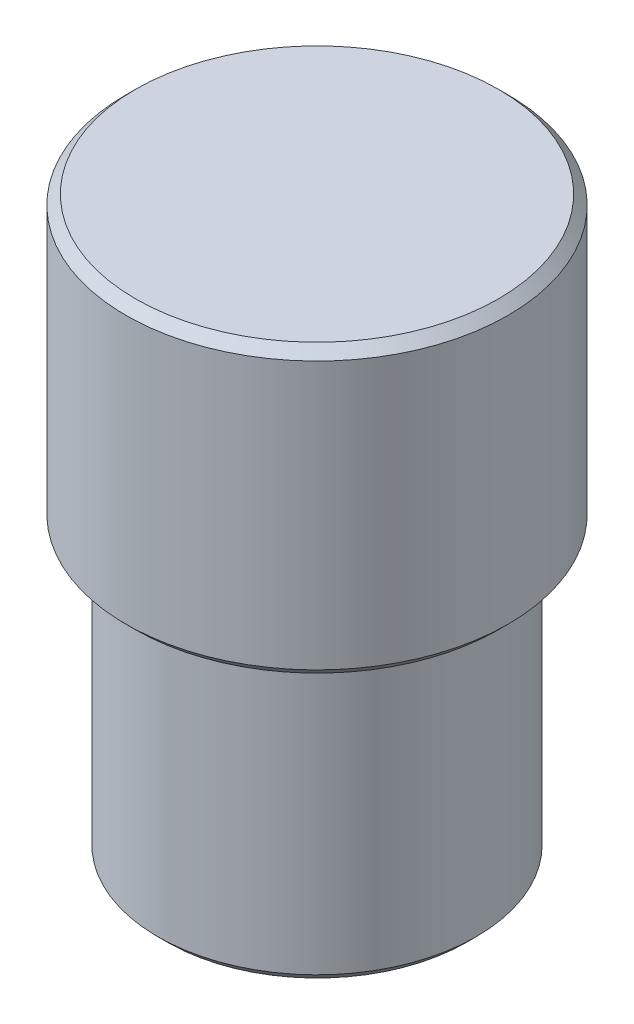
ISO-10303-21;
HEADER;
FILE_DESCRIPTION(('STEP AP214'),'2;1');
FILE_NAME('part.step','',(''),(''),'','','');
FILE_SCHEMA(('AUTOMOTIVE_DESIGN { 1 0 10303 214 1 1 1 1 }'));
ENDSEC;
DATA;
#1=APPLICATION_CONTEXT('core data for automotive mechanical design processes');
#2=APPLICATION_PROTOCOL_DEFINITION('international standard','automotive_design',2000,#1);
#3=PRODUCT_CONTEXT('',#1,'mechanical');
#4=PRODUCT('Part','Part','',(#3));
#5=PRODUCT_RELATED_PRODUCT_CATEGORY('part','',(#4));
#6=PRODUCT_DEFINITION_FORMATION('','',#4);
#7=PRODUCT_DEFINITION_CONTEXT('part definition',#1,'design');
#8=PRODUCT_DEFINITION('design','',#6,#7);
#9=PRODUCT_DEFINITION_SHAPE('','',#8);
#10=(LENGTH_UNIT() NAMED_UNIT(*) SI_UNIT(.MILLI.,.METRE.));
#11=(NAMED_UNIT(*) PLANE_ANGLE_UNIT() SI_UNIT($,.RADIAN.));
#12=(NAMED_UNIT(*) SI_UNIT($,.STERADIAN.) SOLID_ANGLE_UNIT());
#13=UNCERTAINTY_MEASURE_WITH_UNIT(LENGTH_MEASURE(1.E-05),#10,'distance_accuracy_value','');
#14=(GEOMETRIC_REPRESENTATION_CONTEXT(3) GLOBAL_UNCERTAINTY_ASSIGNED_CONTEXT((#13)) GLOBAL_UNIT_ASSIGNED_CONTEXT((#10,
#11,#12)) REPRESENTATION_CONTEXT('',''));
#15=CARTESIAN_POINT('',(0.,0.,0.));
#16=DIRECTION('',(0.,0.,1.));
#17=DIRECTION('',(1.,0.,0.));
#18=AXIS2_PLACEMENT_3D('',#15,#16,#17);
#19=CARTESIAN_POINT('',(0.,0.,0.));
#20=DIRECTION('',(0.,-1.,0.));
#21=DIRECTION('',(1.,0.,0.));
#22=AXIS2_PLACEMENT_3D('',#19,#20,#21);
#23=PLANE('',#22);
#24=CARTESIAN_POINT('',(0.,0.,0.));
#25=DIRECTION('',(0.,-1.,0.));
#26=DIRECTION('',(1.,0.,0.));
#27=AXIS2_PLACEMENT_3D('',#24,#25,#26);
#28=CIRCLE('',#27,4.70000000000004);
#29=CARTESIAN_POINT('',(4.70000000000004,0.,0.));
#30=VERTEX_POINT('',#29);
#31=EDGE_CURVE('E63',#30,#30,#28,.T.);
#32=ORIENTED_EDGE('',*,*,#31,.T.);
#33=EDGE_LOOP('',(#32));
#34=FACE_BOUND('',#33,.T.);
#35=ADVANCED_FACE('F52',(#34),#23,.T.);
#36=CARTESIAN_POINT('',(3.49148336110938E-12,-1000.,0.));
#37=DIRECTION('',(0.,-1.,0.));
#38=DIRECTION('',(1.,0.,0.));
#39=AXIS2_PLACEMENT_3D('',#36,#37,#38);
#40=CYLINDRICAL_SURFACE('',#39,5.00000000000002);
#41=CARTESIAN_POINT('',(0.,0.299999999999967,0.));
#42=DIRECTION('',(0.,-1.,0.));
#43=DIRECTION('',(1.,0.,0.));
#44=AXIS2_PLACEMENT_3D('',#41,#42,#43);
#45=CIRCLE('',#44,5.00000000000002);
#46=CARTESIAN_POINT('',(5.00000000000002,0.299999999999984,0.));
#47=VERTEX_POINT('',#46);
#48=EDGE_CURVE('E59',#47,#47,#45,.F.);
#49=ORIENTED_EDGE('',*,*,#48,.T.);
#50=EDGE_LOOP('',(#49));
#51=FACE_BOUND('',#50,.T.);
#52=CARTESIAN_POINT('',(0.,8.9999999999999,0.));
#53=DIRECTION('',(0.,-1.,0.));
#54=DIRECTION('',(1.,0.,0.));
#55=AXIS2_PLACEMENT_3D('',#52,#53,#54);
#56=CIRCLE('',#55,5.00000000000003);
#57=CARTESIAN_POINT('',(5.,8.99999999999991,0.));
#58=VERTEX_POINT('',#57);
#59=EDGE_CURVE('E78',#58,#58,#56,.T.);
#60=ORIENTED_EDGE('',*,*,#59,.T.);
#61=EDGE_LOOP('',(#60));
#62=FACE_BOUND('',#61,.T.);
#63=ADVANCED_FACE('F82',(#51,#62),#40,.T.);
#64=CARTESIAN_POINT('',(5.,9.,0.));
#65=DIRECTION('',(0.,-1.,0.));
#66=DIRECTION('',(1.,0.,0.));
#67=AXIS2_PLACEMENT_3D('',#64,#65,#66);
#68=PLANE('',#67);
#69=CARTESIAN_POINT('',(0.,8.99999999999998,0.));
#70=DIRECTION('',(0.,-1.,0.));
#71=DIRECTION('',(1.,0.,0.));
#72=AXIS2_PLACEMENT_3D('',#69,#70,#71);
#73=CIRCLE('',#72,5.70000000000042);
#74=CARTESIAN_POINT('',(5.70000000000039,9.,0.));
#75=VERTEX_POINT('',#74);
#76=EDGE_CURVE('E75',#75,#75,#73,.T.);
#77=ORIENTED_EDGE('',*,*,#76,.T.);
#78=EDGE_LOOP('',(#77));
#79=FACE_BOUND('',#78,.T.);
#80=ORIENTED_EDGE('',*,*,#59,.F.);
#81=EDGE_LOOP('',(#80));
#82=FACE_BOUND('',#81,.T.);
#83=ADVANCED_FACE('F84',(#79,#82),#68,.T.);
#84=CARTESIAN_POINT('',(3.49148336110938E-12,-1000.,0.));
#85=DIRECTION('',(0.,-1.,0.));
#86=DIRECTION('',(1.,0.,0.));
#87=AXIS2_PLACEMENT_3D('',#84,#85,#86);
#88=CYLINDRICAL_SURFACE('',#87,6.00000000000005);
#89=CARTESIAN_POINT('',(0.,9.29999999999964,0.));
#90=DIRECTION('',(0.,-1.,0.));
#91=DIRECTION('',(1.,0.,0.));
#92=AXIS2_PLACEMENT_3D('',#89,#90,#91);
#93=CIRCLE('',#92,6.00000000000005);
#94=CARTESIAN_POINT('',(6.00000000000002,9.29999999999966,0.));
#95=VERTEX_POINT('',#94);
#96=EDGE_CURVE('E67',#95,#95,#93,.F.);
#97=ORIENTED_EDGE('',*,*,#96,.T.);
#98=EDGE_LOOP('',(#97));
#99=FACE_BOUND('',#98,.T.);
#100=CARTESIAN_POINT('',(0.,17.7,0.));
#101=DIRECTION('',(0.,1.,0.));
#102=DIRECTION('',(-1.,0.,0.));
#103=AXIS2_PLACEMENT_3D('',#100,#101,#102);
#104=CIRCLE('',#103,6.00000000000005);
#105=CARTESIAN_POINT('',(-6.00000000000011,17.7,0.));
#106=VERTEX_POINT('',#105);
#107=EDGE_CURVE('E72',#106,#106,#104,.F.);
#108=ORIENTED_EDGE('',*,*,#107,.T.);
#109=EDGE_LOOP('',(#108));
#110=FACE_BOUND('',#109,.T.);
#111=ADVANCED_FACE('F86',(#99,#110),#88,.T.);
#112=CARTESIAN_POINT('',(6.,18.,0.));
#113=DIRECTION('',(0.,1.,0.));
#114=DIRECTION('',(-1.,0.,0.));
#115=AXIS2_PLACEMENT_3D('',#112,#113,#114);
#116=PLANE('',#115);
#117=CARTESIAN_POINT('',(0.,18.,0.));
#118=DIRECTION('',(0.,1.,0.));
#119=DIRECTION('',(-1.,0.,0.));
#120=AXIS2_PLACEMENT_3D('',#117,#118,#119);
#121=CIRCLE('',#120,5.70000000000009);
#122=CARTESIAN_POINT('',(-5.70000000000016,18.,0.));
#123=VERTEX_POINT('',#122);
#124=EDGE_CURVE('E11',#123,#123,#121,.T.);
#125=ORIENTED_EDGE('',*,*,#124,.T.);
#126=EDGE_LOOP('',(#125));
#127=FACE_BOUND('',#126,.T.);
#128=ADVANCED_FACE('F93',(#127),#116,.T.);
#129=CARTESIAN_POINT('',(0.,8.9999999999999,0.));
#130=DIRECTION('',(0.,1.,0.));
#131=DIRECTION('',(-1.,0.,0.));
#132=AXIS2_PLACEMENT_3D('',#129,#130,#131);
#133=CONICAL_SURFACE('',#132,5.70000000000034,0.785398163397391);
#134=ORIENTED_EDGE('',*,*,#96,.F.);
#135=EDGE_LOOP('',(#134));
#136=FACE_BOUND('',#135,.T.);
#137=ORIENTED_EDGE('',*,*,#76,.F.);
#138=EDGE_LOOP('',(#137));
#139=FACE_BOUND('',#138,.T.);
#140=ADVANCED_FACE('F103',(#136,#139),#133,.T.);
#141=CARTESIAN_POINT('',(0.,0.,0.));
#142=DIRECTION('',(0.,1.,0.));
#143=DIRECTION('',(-1.,0.,0.));
#144=AXIS2_PLACEMENT_3D('',#141,#142,#143);
#145=CONICAL_SURFACE('',#144,4.70000000000005,0.785398163397443);
#146=ORIENTED_EDGE('',*,*,#48,.F.);
#147=EDGE_LOOP('',(#146));
#148=FACE_BOUND('',#147,.T.);
#149=ORIENTED_EDGE('',*,*,#31,.F.);
#150=EDGE_LOOP('',(#149));
#151=FACE_BOUND('',#150,.T.);
#152=ADVANCED_FACE('F105',(#148,#151),#145,.T.);
#153=CARTESIAN_POINT('',(0.,17.7,0.));
#154=DIRECTION('',(0.,-1.,0.));
#155=DIRECTION('',(1.,0.,0.));
#156=AXIS2_PLACEMENT_3D('',#153,#154,#155);
#157=CONICAL_SURFACE('',#156,6.00000000000005,0.785398163397479);
#158=ORIENTED_EDGE('',*,*,#124,.F.);
#159=EDGE_LOOP('',(#158));
#160=FACE_BOUND('',#159,.T.);
#161=ORIENTED_EDGE('',*,*,#107,.F.);
#162=EDGE_LOOP('',(#161));
#163=FACE_BOUND('',#162,.T.);
#164=ADVANCED_FACE('F54',(#160,#163),#157,.T.);
#165=CLOSED_SHELL('',(#35,#63,#83,#111,#128,#140,#152,#164));
#166=MANIFOLD_SOLID_BREP('B2',#165);
#167=ADVANCED_BREP_SHAPE_REPRESENTATION('',(#18,#166),#14);
#168=SHAPE_DEFINITION_REPRESENTATION(#9,#167);
ENDSEC;
END-ISO-10303-21;
